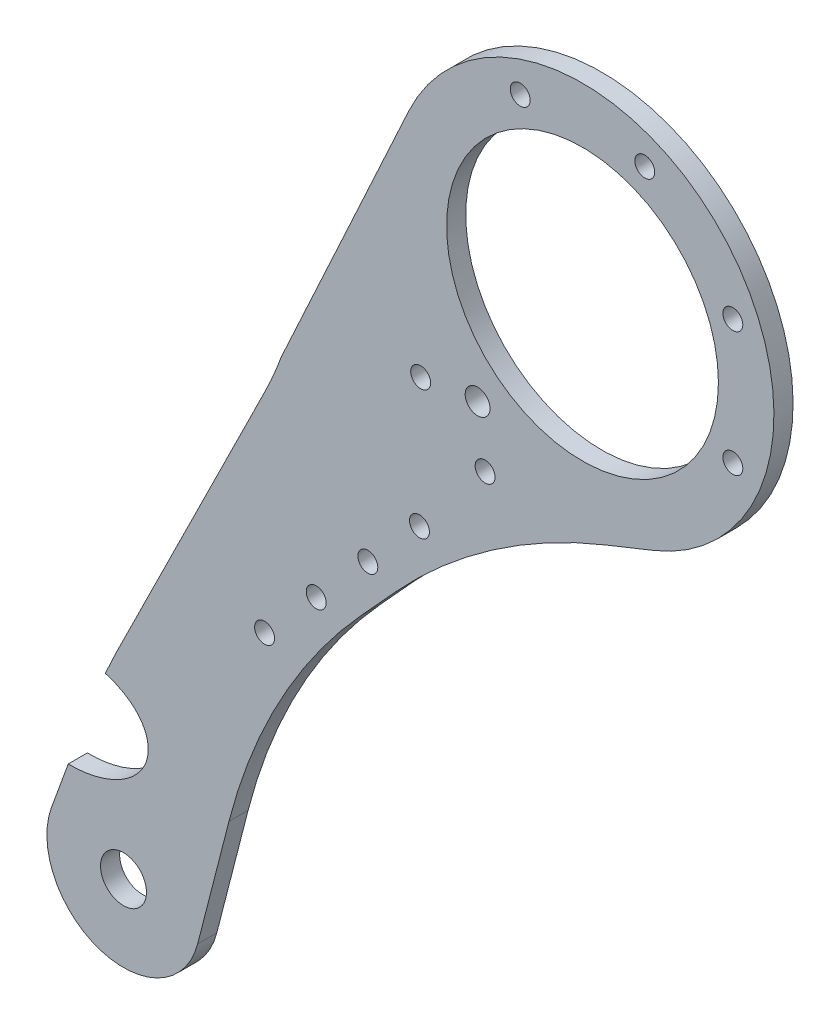
ISO-10303-21;
HEADER;
FILE_DESCRIPTION(('STEP AP214'),'2;1');
FILE_NAME('part.step','',(''),(''),'','','');
FILE_SCHEMA(('AUTOMOTIVE_DESIGN { 1 0 10303 214 1 1 1 1 }'));
ENDSEC;
DATA;
#1=APPLICATION_CONTEXT('core data for automotive mechanical design processes');
#2=APPLICATION_PROTOCOL_DEFINITION('international standard','automotive_design',2000,#1);
#3=PRODUCT_CONTEXT('',#1,'mechanical');
#4=PRODUCT('Part','Part','',(#3));
#5=PRODUCT_RELATED_PRODUCT_CATEGORY('part','',(#4));
#6=PRODUCT_DEFINITION_FORMATION('','',#4);
#7=PRODUCT_DEFINITION_CONTEXT('part definition',#1,'design');
#8=PRODUCT_DEFINITION('design','',#6,#7);
#9=PRODUCT_DEFINITION_SHAPE('','',#8);
#10=(LENGTH_UNIT() NAMED_UNIT(*) SI_UNIT(.MILLI.,.METRE.));
#11=(NAMED_UNIT(*) PLANE_ANGLE_UNIT() SI_UNIT($,.RADIAN.));
#12=(NAMED_UNIT(*) SI_UNIT($,.STERADIAN.) SOLID_ANGLE_UNIT());
#13=UNCERTAINTY_MEASURE_WITH_UNIT(LENGTH_MEASURE(1.E-05),#10,'distance_accuracy_value','');
#14=(GEOMETRIC_REPRESENTATION_CONTEXT(3) GLOBAL_UNCERTAINTY_ASSIGNED_CONTEXT((#13)) GLOBAL_UNIT_ASSIGNED_CONTEXT((#10,
#11,#12)) REPRESENTATION_CONTEXT('',''));
#15=CARTESIAN_POINT('',(0.,0.,0.));
#16=DIRECTION('',(0.,0.,1.));
#17=DIRECTION('',(1.,0.,0.));
#18=AXIS2_PLACEMENT_3D('',#15,#16,#17);
#19=CARTESIAN_POINT('',(-87.2473558230127,-77.9723044074539,-5.));
#20=DIRECTION('',(0.,0.,-1.));
#21=DIRECTION('',(1.,0.,0.));
#22=AXIS2_PLACEMENT_3D('',#19,#20,#21);
#23=PLANE('',#22);
#24=CARTESIAN_POINT('',(18.3767093876581,44.2943786461941,-5.));
#25=DIRECTION('',(0.,0.,1.));
#26=DIRECTION('',(1.,0.,0.));
#27=AXIS2_PLACEMENT_3D('',#24,#25,#26);
#28=CIRCLE('',#27,3.25);
#29=CARTESIAN_POINT('',(21.6267093876581,44.2943786461941,-5.));
#30=VERTEX_POINT('',#29);
#31=EDGE_CURVE('E346',#30,#30,#28,.T.);
#32=ORIENTED_EDGE('',*,*,#31,.T.);
#33=EDGE_LOOP('',(#32));
#34=FACE_BOUND('',#33,.T.);
#35=CARTESIAN_POINT('',(29.5069278175342,119.260159091029,-5.));
#36=DIRECTION('',(0.,0.,1.));
#37=DIRECTION('',(1.,0.,0.));
#38=AXIS2_PLACEMENT_3D('',#35,#36,#37);
#39=CIRCLE('',#38,2.6);
#40=CARTESIAN_POINT('',(32.1069278175342,119.260159091029,-5.));
#41=VERTEX_POINT('',#40);
#42=EDGE_CURVE('E360',#41,#41,#39,.T.);
#43=ORIENTED_EDGE('',*,*,#42,.T.);
#44=EDGE_LOOP('',(#43));
#45=FACE_BOUND('',#44,.T.);
#46=CARTESIAN_POINT('',(62.0350195685669,119.260159091029,-5.));
#47=DIRECTION('',(0.,0.,1.));
#48=DIRECTION('',(1.,0.,0.));
#49=AXIS2_PLACEMENT_3D('',#46,#47,#48);
#50=CIRCLE('',#49,2.6);
#51=CARTESIAN_POINT('',(64.6350195685669,119.260159091029,-5.));
#52=VERTEX_POINT('',#51);
#53=EDGE_CURVE('E368',#52,#52,#50,.T.);
#54=ORIENTED_EDGE('',*,*,#53,.T.);
#55=EDGE_LOOP('',(#54));
#56=FACE_BOUND('',#55,.T.);
#57=CARTESIAN_POINT('',(85.0358538247802,96.259324834816,-5.));
#58=DIRECTION('',(0.,0.,1.));
#59=DIRECTION('',(1.,0.,0.));
#60=AXIS2_PLACEMENT_3D('',#57,#58,#59);
#61=CIRCLE('',#60,2.60000000000002);
#62=CARTESIAN_POINT('',(87.6358538247802,96.259324834816,-5.));
#63=VERTEX_POINT('',#62);
#64=EDGE_CURVE('E376',#63,#63,#61,.T.);
#65=ORIENTED_EDGE('',*,*,#64,.T.);
#66=EDGE_LOOP('',(#65));
#67=FACE_BOUND('',#66,.T.);
#68=CARTESIAN_POINT('',(85.0358538247802,63.7312330837833,-5.));
#69=DIRECTION('',(0.,0.,1.));
#70=DIRECTION('',(1.,0.,0.));
#71=AXIS2_PLACEMENT_3D('',#68,#69,#70);
#72=CIRCLE('',#71,2.6);
#73=CARTESIAN_POINT('',(87.6358538247802,63.7312330837833,-5.));
#74=VERTEX_POINT('',#73);
#75=EDGE_CURVE('E352',#74,#74,#72,.T.);
#76=ORIENTED_EDGE('',*,*,#75,.T.);
#77=EDGE_LOOP('',(#76));
#78=FACE_BOUND('',#77,.T.);
#79=CARTESIAN_POINT('',(-23.7747681862979,-21.0648015144859,-5.));
#80=DIRECTION('',(0.,0.,1.));
#81=DIRECTION('',(1.,0.,0.));
#82=AXIS2_PLACEMENT_3D('',#79,#80,#81);
#83=CIRCLE('',#82,2.6);
#84=CARTESIAN_POINT('',(-21.1747681862979,-21.0648015144859,-5.));
#85=VERTEX_POINT('',#84);
#86=EDGE_CURVE('E395',#85,#85,#83,.T.);
#87=ORIENTED_EDGE('',*,*,#86,.T.);
#88=EDGE_LOOP('',(#87));
#89=FACE_BOUND('',#88,.T.);
#90=CARTESIAN_POINT('',(-37.2593092551394,-35.8352839765698,-5.));
#91=DIRECTION('',(0.,0.,1.));
#92=DIRECTION('',(1.,0.,0.));
#93=AXIS2_PLACEMENT_3D('',#90,#91,#92);
#94=CIRCLE('',#93,2.6);
#95=CARTESIAN_POINT('',(-34.6593092551394,-35.8352839765698,-5.));
#96=VERTEX_POINT('',#95);
#97=EDGE_CURVE('E411',#96,#96,#94,.T.);
#98=ORIENTED_EDGE('',*,*,#97,.T.);
#99=EDGE_LOOP('',(#98));
#100=FACE_BOUND('',#99,.T.);
#101=CARTESIAN_POINT('',(3.50503646705098,42.3364857628933,-5.));
#102=DIRECTION('',(0.,0.,1.));
#103=DIRECTION('',(1.,0.,0.));
#104=AXIS2_PLACEMENT_3D('',#101,#102,#103);
#105=CIRCLE('',#104,2.6);
#106=CARTESIAN_POINT('',(6.10503646705098,42.3364857628933,-5.));
#107=VERTEX_POINT('',#106);
#108=EDGE_CURVE('E419',#107,#107,#105,.T.);
#109=ORIENTED_EDGE('',*,*,#108,.T.);
#110=EDGE_LOOP('',(#109));
#111=FACE_BOUND('',#110,.T.);
#112=CARTESIAN_POINT('',(-74.1078932401975,-109.9952789593,-5.));
#113=DIRECTION('',(0.,0.,1.));
#114=DIRECTION('',(1.,0.,0.));
#115=AXIS2_PLACEMENT_3D('',#112,#113,#114);
#116=CIRCLE('',#115,6.00000000000002);
#117=CARTESIAN_POINT('',(-68.1078932401974,-109.9952789593,-5.));
#118=VERTEX_POINT('',#117);
#119=EDGE_CURVE('E433',#118,#118,#116,.T.);
#120=ORIENTED_EDGE('',*,*,#119,.T.);
#121=EDGE_LOOP('',(#120));
#122=FACE_BOUND('',#121,.T.);
#123=CARTESIAN_POINT('',(20.3346022709589,29.4227057255869,-5.));
#124=DIRECTION('',(0.,0.,1.));
#125=DIRECTION('',(1.,0.,0.));
#126=AXIS2_PLACEMENT_3D('',#123,#124,#125);
#127=CIRCLE('',#126,2.6);
#128=CARTESIAN_POINT('',(22.9346022709589,29.4227057255869,-5.));
#129=VERTEX_POINT('',#128);
#130=EDGE_CURVE('E427',#129,#129,#127,.T.);
#131=ORIENTED_EDGE('',*,*,#130,.T.);
#132=EDGE_LOOP('',(#131));
#133=FACE_BOUND('',#132,.T.);
#134=CARTESIAN_POINT('',(-10.2902271174564,-6.294319052402,-5.));
#135=DIRECTION('',(0.,0.,1.));
#136=DIRECTION('',(1.,0.,0.));
#137=AXIS2_PLACEMENT_3D('',#134,#135,#136);
#138=CIRCLE('',#137,2.6);
#139=CARTESIAN_POINT('',(-7.69022711745644,-6.294319052402,-5.));
#140=VERTEX_POINT('',#139);
#141=EDGE_CURVE('E403',#140,#140,#138,.T.);
#142=ORIENTED_EDGE('',*,*,#141,.T.);
#143=EDGE_LOOP('',(#142));
#144=FACE_BOUND('',#143,.T.);
#145=CARTESIAN_POINT('',(3.19431395138503,8.4761634096819,-5.));
#146=DIRECTION('',(0.,0.,1.));
#147=DIRECTION('',(1.,0.,0.));
#148=AXIS2_PLACEMENT_3D('',#145,#146,#147);
#149=CIRCLE('',#148,2.6);
#150=CARTESIAN_POINT('',(5.79431395138502,8.4761634096819,-5.));
#151=VERTEX_POINT('',#150);
#152=EDGE_CURVE('E387',#151,#151,#149,.T.);
#153=ORIENTED_EDGE('',*,*,#152,.T.);
#154=EDGE_LOOP('',(#153));
#155=FACE_BOUND('',#154,.T.);
#156=CARTESIAN_POINT('',(-74.1078932401975,-109.9952789593,-5.));
#157=DIRECTION('',(0.,0.,1.));
#158=DIRECTION('',(1.,0.,0.));
#159=AXIS2_PLACEMENT_3D('',#156,#157,#158);
#160=CIRCLE('',#159,20.0000000000002);
#161=CARTESIAN_POINT('',(-92.9017456559157,-103.154876092786,-5.));
#162=VERTEX_POINT('',#161);
#163=CARTESIAN_POINT('',(-54.7372550512299,-114.973067238457,-5.));
#164=VERTEX_POINT('',#163);
#165=EDGE_CURVE('E290',#162,#164,#160,.T.);
#166=ORIENTED_EDGE('',*,*,#165,.F.);
#167=DIRECTION('',(-0.342020143325669,-0.939692620785908,0.));
#168=VECTOR('',#167,1.);
#169=CARTESIAN_POINT('',(-88.5355343691892,-91.158809173937,-5.));
#170=LINE('',#169,#168);
#171=CARTESIAN_POINT('',(-88.5355343691892,-91.158809173937,-5.));
#172=VERTEX_POINT('',#171);
#173=EDGE_CURVE('E204',#172,#162,#170,.T.);
#174=ORIENTED_EDGE('',*,*,#173,.F.);
#175=CARTESIAN_POINT('',(-87.2473558230127,-77.9723044074539,-5.));
#176=DIRECTION('',(0.,0.,-1.));
#177=DIRECTION('',(0.998564288915161,0.0535664158158636,0.));
#178=AXIS2_PLACEMENT_3D('',#175,#176,#177);
#179=ELLIPSE('',#178,19.6254544070607,13.1666159932936);
#180=CARTESIAN_POINT('',(-78.8301753664011,-65.8229118304964,-5.));
#181=VERTEX_POINT('',#180);
#182=EDGE_CURVE('E199',#181,#172,#179,.T.);
#183=ORIENTED_EDGE('',*,*,#182,.F.);
#184=CARTESIAN_POINT('',(104.071308496632,-146.736737600266,-5.));
#185=DIRECTION('',(0.,0.,1.));
#186=DIRECTION('',(1.,0.,0.));
#187=AXIS2_PLACEMENT_3D('',#184,#185,#186);
#188=CIRCLE('',#187,200.);
#189=CARTESIAN_POINT('',(-75.1568945937203,-57.9828575892863,-5.));
#190=VERTEX_POINT('',#189);
#191=EDGE_CURVE('E195',#190,#181,#188,.T.);
#192=ORIENTED_EDGE('',*,*,#191,.F.);
#193=DIRECTION('',(-0.443769400054901,-0.896141015451761,0.));
#194=VECTOR('',#193,1.);
#195=CARTESIAN_POINT('',(-37.2097827502313,18.6469491001312,-5.));
#196=LINE('',#195,#194);
#197=CARTESIAN_POINT('',(-37.2097827502313,18.6469491001312,-5.));
#198=VERTEX_POINT('',#197);
#199=EDGE_CURVE('E191',#198,#190,#196,.T.);
#200=ORIENTED_EDGE('',*,*,#199,.F.);
#201=CARTESIAN_POINT('',(-126.823884295407,63.0238891056213,-5.));
#202=DIRECTION('',(0.,0.,-1.));
#203=DIRECTION('',(1.,0.,0.));
#204=AXIS2_PLACEMENT_3D('',#201,#202,#203);
#205=CIRCLE('',#204,100.);
#206=CARTESIAN_POINT('',(-32.8546222168167,28.8218747730539,-5.));
#207=VERTEX_POINT('',#206);
#208=EDGE_CURVE('E179',#207,#198,#205,.T.);
#209=ORIENTED_EDGE('',*,*,#208,.F.);
#210=DIRECTION('',(-0.418420104800895,-0.908253607699088,0.));
#211=VECTOR('',#210,1.);
#212=CARTESIAN_POINT('',(0.358293308096093,100.916284199344,-5.));
#213=LINE('',#212,#211);
#214=CARTESIAN_POINT('',(0.358293308096093,100.916284199344,-5.));
#215=VERTEX_POINT('',#214);
#216=EDGE_CURVE('E173',#215,#207,#213,.T.);
#217=ORIENTED_EDGE('',*,*,#216,.F.);
#218=CARTESIAN_POINT('',(45.7709736930505,79.9952789592997,-5.));
#219=DIRECTION('',(0.,0.,1.));
#220=DIRECTION('',(1.,0.,0.));
#221=AXIS2_PLACEMENT_3D('',#218,#219,#220);
#222=CIRCLE('',#221,50.);
#223=CARTESIAN_POINT('',(64.3764573363395,33.5858404968565,-5.));
#224=VERTEX_POINT('',#223);
#225=EDGE_CURVE('E147',#224,#215,#222,.T.);
#226=ORIENTED_EDGE('',*,*,#225,.F.);
#227=DIRECTION('',(-0.928188769248865,-0.37210967286578,0.));
#228=VECTOR('',#227,1.);
#229=CARTESIAN_POINT('',(-2.68622157797908,6.70049956291646,-5.));
#230=LINE('',#229,#228);
#231=CARTESIAN_POINT('',(51.8864623927853,28.5786177351522,-5.));
#232=VERTEX_POINT('',#231);
#233=EDGE_CURVE('E159',#224,#232,#230,.T.);
#234=ORIENTED_EDGE('',*,*,#233,.T.);
#235=CARTESIAN_POINT('',(107.702913322652,-110.649697652178,-5.));
#236=DIRECTION('',(0.,0.,1.));
#237=DIRECTION('',(1.,0.,0.));
#238=AXIS2_PLACEMENT_3D('',#235,#236,#237);
#239=CIRCLE('',#238,150.);
#240=CARTESIAN_POINT('',(-3.07570514297694,-9.51563963586652,-5.));
#241=VERTEX_POINT('',#240);
#242=EDGE_CURVE('E327',#241,#232,#239,.F.);
#243=ORIENTED_EDGE('',*,*,#242,.F.);
#244=DIRECTION('',(0.674227053442074,0.738524123104194,0.));
#245=VECTOR('',#244,1.);
#246=CARTESIAN_POINT('',(3.06060587253825,-2.79414472003352,-5.));
#247=LINE('',#246,#245);
#248=CARTESIAN_POINT('',(-12.060299563704,-19.3570419974885,-5.));
#249=VERTEX_POINT('',#248);
#250=EDGE_CURVE('E166',#249,#241,#247,.T.);
#251=ORIENTED_EDGE('',*,*,#250,.F.);
#252=CARTESIAN_POINT('',(98.7183189019252,-120.4911000138,-5.));
#253=DIRECTION('',(0.,0.,1.));
#254=DIRECTION('',(1.,0.,0.));
#255=AXIS2_PLACEMENT_3D('',#252,#253,#254);
#256=CIRCLE('',#255,150.);
#257=CARTESIAN_POINT('',(-46.5614675153302,-83.1576879201177,-5.));
#258=VERTEX_POINT('',#257);
#259=EDGE_CURVE('E58',#258,#249,#256,.F.);
#260=ORIENTED_EDGE('',*,*,#259,.F.);
#261=DIRECTION('',(-0.248889413957879,-0.968531909448369,0.));
#262=VECTOR('',#261,1.);
#263=CARTESIAN_POINT('',(-23.6314026287413,6.07270229704667,-5.));
#264=LINE('',#263,#262);
#265=EDGE_CURVE('E156',#258,#164,#264,.T.);
#266=ORIENTED_EDGE('',*,*,#265,.T.);
#267=EDGE_LOOP('',(#166,#174,#183,#192,#200,#209,#217,#226,#234,#243,#251,#260,#266));
#268=FACE_BOUND('',#267,.T.);
#269=CARTESIAN_POINT('',(45.7709736930505,79.9952789592997,-5.));
#270=DIRECTION('',(0.,0.,1.));
#271=DIRECTION('',(1.,0.,0.));
#272=AXIS2_PLACEMENT_3D('',#269,#270,#271);
#273=CIRCLE('',#272,35.5);
#274=CARTESIAN_POINT('',(81.2709736930505,79.9952789592997,-5.));
#275=VERTEX_POINT('',#274);
#276=EDGE_CURVE('E707',#275,#275,#273,.T.);
#277=ORIENTED_EDGE('',*,*,#276,.T.);
#278=EDGE_LOOP('',(#277));
#279=FACE_BOUND('',#278,.T.);
#280=ADVANCED_FACE('F49',(#34,#45,#56,#67,#78,#89,#100,#111,#122,#133,#144,#155,#268,#279),#23,.T.);
#281=CARTESIAN_POINT('',(-87.2473558230127,-77.9723044074539,0.));
#282=DIRECTION('',(0.,0.,-1.));
#283=DIRECTION('',(1.,0.,0.));
#284=AXIS2_PLACEMENT_3D('',#281,#282,#283);
#285=PLANE('',#284);
#286=CARTESIAN_POINT('',(3.19431395138503,8.4761634096819,0.));
#287=DIRECTION('',(0.,0.,1.));
#288=DIRECTION('',(1.,0.,0.));
#289=AXIS2_PLACEMENT_3D('',#286,#287,#288);
#290=CIRCLE('',#289,2.6);
#291=CARTESIAN_POINT('',(5.79431395138502,8.4761634096819,0.));
#292=VERTEX_POINT('',#291);
#293=EDGE_CURVE('E359',#292,#292,#290,.T.);
#294=ORIENTED_EDGE('',*,*,#293,.F.);
#295=EDGE_LOOP('',(#294));
#296=FACE_BOUND('',#295,.T.);
#297=CARTESIAN_POINT('',(-23.7747681862979,-21.0648015144859,0.));
#298=DIRECTION('',(0.,0.,1.));
#299=DIRECTION('',(1.,0.,0.));
#300=AXIS2_PLACEMENT_3D('',#297,#298,#299);
#301=CIRCLE('',#300,2.6);
#302=CARTESIAN_POINT('',(-21.1747681862979,-21.0648015144859,0.));
#303=VERTEX_POINT('',#302);
#304=EDGE_CURVE('E391',#303,#303,#301,.T.);
#305=ORIENTED_EDGE('',*,*,#304,.F.);
#306=EDGE_LOOP('',(#305));
#307=FACE_BOUND('',#306,.T.);
#308=CARTESIAN_POINT('',(-10.2902271174564,-6.294319052402,0.));
#309=DIRECTION('',(0.,0.,1.));
#310=DIRECTION('',(1.,0.,0.));
#311=AXIS2_PLACEMENT_3D('',#308,#309,#310);
#312=CIRCLE('',#311,2.6);
#313=CARTESIAN_POINT('',(-7.69022711745644,-6.294319052402,0.));
#314=VERTEX_POINT('',#313);
#315=EDGE_CURVE('E399',#314,#314,#312,.T.);
#316=ORIENTED_EDGE('',*,*,#315,.F.);
#317=EDGE_LOOP('',(#316));
#318=FACE_BOUND('',#317,.T.);
#319=CARTESIAN_POINT('',(-37.2593092551394,-35.8352839765698,0.));
#320=DIRECTION('',(0.,0.,1.));
#321=DIRECTION('',(1.,0.,0.));
#322=AXIS2_PLACEMENT_3D('',#319,#320,#321);
#323=CIRCLE('',#322,2.6);
#324=CARTESIAN_POINT('',(-34.6593092551394,-35.8352839765698,0.));
#325=VERTEX_POINT('',#324);
#326=EDGE_CURVE('E407',#325,#325,#323,.T.);
#327=ORIENTED_EDGE('',*,*,#326,.F.);
#328=EDGE_LOOP('',(#327));
#329=FACE_BOUND('',#328,.T.);
#330=CARTESIAN_POINT('',(3.50503646705098,42.3364857628933,0.));
#331=DIRECTION('',(0.,0.,1.));
#332=DIRECTION('',(1.,0.,0.));
#333=AXIS2_PLACEMENT_3D('',#330,#331,#332);
#334=CIRCLE('',#333,2.6);
#335=CARTESIAN_POINT('',(6.10503646705098,42.3364857628933,0.));
#336=VERTEX_POINT('',#335);
#337=EDGE_CURVE('E415',#336,#336,#334,.T.);
#338=ORIENTED_EDGE('',*,*,#337,.F.);
#339=EDGE_LOOP('',(#338));
#340=FACE_BOUND('',#339,.T.);
#341=CARTESIAN_POINT('',(20.3346022709589,29.4227057255869,0.));
#342=DIRECTION('',(0.,0.,1.));
#343=DIRECTION('',(1.,0.,0.));
#344=AXIS2_PLACEMENT_3D('',#341,#342,#343);
#345=CIRCLE('',#344,2.6);
#346=CARTESIAN_POINT('',(22.9346022709589,29.4227057255869,0.));
#347=VERTEX_POINT('',#346);
#348=EDGE_CURVE('E423',#347,#347,#345,.T.);
#349=ORIENTED_EDGE('',*,*,#348,.F.);
#350=EDGE_LOOP('',(#349));
#351=FACE_BOUND('',#350,.T.);
#352=CARTESIAN_POINT('',(-74.1078932401975,-109.9952789593,0.));
#353=DIRECTION('',(0.,0.,1.));
#354=DIRECTION('',(1.,0.,0.));
#355=AXIS2_PLACEMENT_3D('',#352,#353,#354);
#356=CIRCLE('',#355,6.00000000000002);
#357=CARTESIAN_POINT('',(-68.1078932401974,-109.9952789593,0.));
#358=VERTEX_POINT('',#357);
#359=EDGE_CURVE('E185',#358,#358,#356,.T.);
#360=ORIENTED_EDGE('',*,*,#359,.F.);
#361=EDGE_LOOP('',(#360));
#362=FACE_BOUND('',#361,.T.);
#363=CARTESIAN_POINT('',(85.0358538247802,63.7312330837833,0.));
#364=DIRECTION('',(0.,0.,1.));
#365=DIRECTION('',(1.,0.,0.));
#366=AXIS2_PLACEMENT_3D('',#363,#364,#365);
#367=CIRCLE('',#366,2.6);
#368=CARTESIAN_POINT('',(87.6358538247802,63.7312330837833,0.));
#369=VERTEX_POINT('',#368);
#370=EDGE_CURVE('E380',#369,#369,#367,.T.);
#371=ORIENTED_EDGE('',*,*,#370,.F.);
#372=EDGE_LOOP('',(#371));
#373=FACE_BOUND('',#372,.T.);
#374=CARTESIAN_POINT('',(85.0358538247802,96.259324834816,0.));
#375=DIRECTION('',(0.,0.,1.));
#376=DIRECTION('',(1.,0.,0.));
#377=AXIS2_PLACEMENT_3D('',#374,#375,#376);
#378=CIRCLE('',#377,2.60000000000002);
#379=CARTESIAN_POINT('',(87.6358538247802,96.259324834816,0.));
#380=VERTEX_POINT('',#379);
#381=EDGE_CURVE('E372',#380,#380,#378,.T.);
#382=ORIENTED_EDGE('',*,*,#381,.F.);
#383=EDGE_LOOP('',(#382));
#384=FACE_BOUND('',#383,.T.);
#385=CARTESIAN_POINT('',(62.0350195685669,119.260159091029,0.));
#386=DIRECTION('',(0.,0.,1.));
#387=DIRECTION('',(1.,0.,0.));
#388=AXIS2_PLACEMENT_3D('',#385,#386,#387);
#389=CIRCLE('',#388,2.6);
#390=CARTESIAN_POINT('',(64.6350195685669,119.260159091029,0.));
#391=VERTEX_POINT('',#390);
#392=EDGE_CURVE('E364',#391,#391,#389,.T.);
#393=ORIENTED_EDGE('',*,*,#392,.F.);
#394=EDGE_LOOP('',(#393));
#395=FACE_BOUND('',#394,.T.);
#396=CARTESIAN_POINT('',(29.5069278175342,119.260159091029,0.));
#397=DIRECTION('',(0.,0.,1.));
#398=DIRECTION('',(1.,0.,0.));
#399=AXIS2_PLACEMENT_3D('',#396,#397,#398);
#400=CIRCLE('',#399,2.6);
#401=CARTESIAN_POINT('',(32.1069278175342,119.260159091029,0.));
#402=VERTEX_POINT('',#401);
#403=EDGE_CURVE('E355',#402,#402,#400,.T.);
#404=ORIENTED_EDGE('',*,*,#403,.F.);
#405=EDGE_LOOP('',(#404));
#406=FACE_BOUND('',#405,.T.);
#407=CARTESIAN_POINT('',(18.3767093876581,44.2943786461941,0.));
#408=DIRECTION('',(0.,0.,1.));
#409=DIRECTION('',(1.,0.,0.));
#410=AXIS2_PLACEMENT_3D('',#407,#408,#409);
#411=CIRCLE('',#410,3.25);
#412=CARTESIAN_POINT('',(21.6267093876581,44.2943786461941,0.));
#413=VERTEX_POINT('',#412);
#414=EDGE_CURVE('E348',#413,#413,#411,.T.);
#415=ORIENTED_EDGE('',*,*,#414,.F.);
#416=EDGE_LOOP('',(#415));
#417=FACE_BOUND('',#416,.T.);
#418=DIRECTION('',(0.674227053442074,0.738524123104194,0.));
#419=VECTOR('',#418,1.);
#420=CARTESIAN_POINT('',(-75.4254611049529,-88.7649664106359,0.));
#421=LINE('',#420,#419);
#422=CARTESIAN_POINT('',(-12.060299563704,-19.3570419974885,0.));
#423=VERTEX_POINT('',#422);
#424=CARTESIAN_POINT('',(-3.07570514297693,-9.51563963586652,0.));
#425=VERTEX_POINT('',#424);
#426=EDGE_CURVE('E311',#423,#425,#421,.T.);
#427=ORIENTED_EDGE('',*,*,#426,.T.);
#428=CARTESIAN_POINT('',(107.702913322652,-110.649697652178,0.));
#429=DIRECTION('',(0.,0.,1.));
#430=DIRECTION('',(1.,0.,0.));
#431=AXIS2_PLACEMENT_3D('',#428,#429,#430);
#432=CIRCLE('',#431,150.);
#433=CARTESIAN_POINT('',(51.8864623927853,28.5786177351522,0.));
#434=VERTEX_POINT('',#433);
#435=EDGE_CURVE('E330',#434,#425,#432,.T.);
#436=ORIENTED_EDGE('',*,*,#435,.F.);
#437=DIRECTION('',(-0.928188769248865,-0.37210967286578,0.));
#438=VECTOR('',#437,1.);
#439=CARTESIAN_POINT('',(-104.783518952916,-34.2301744393261,0.));
#440=LINE('',#439,#438);
#441=CARTESIAN_POINT('',(64.3764573363395,33.5858404968565,0.));
#442=VERTEX_POINT('',#441);
#443=EDGE_CURVE('E308',#442,#434,#440,.T.);
#444=ORIENTED_EDGE('',*,*,#443,.F.);
#445=CARTESIAN_POINT('',(45.7709736930505,79.9952789592997,0.));
#446=DIRECTION('',(0.,0.,1.));
#447=DIRECTION('',(1.,0.,0.));
#448=AXIS2_PLACEMENT_3D('',#445,#446,#447);
#449=CIRCLE('',#448,50.);
#450=CARTESIAN_POINT('',(0.358293308096093,100.916284199344,0.));
#451=VERTEX_POINT('',#450);
#452=EDGE_CURVE('E150',#442,#451,#449,.T.);
#453=ORIENTED_EDGE('',*,*,#452,.T.);
#454=DIRECTION('',(-0.418420104800895,-0.908253607699088,0.));
#455=VECTOR('',#454,1.);
#456=CARTESIAN_POINT('',(0.358293308096093,100.916284199344,0.));
#457=LINE('',#456,#455);
#458=CARTESIAN_POINT('',(-32.8546222168167,28.8218747730539,0.));
#459=VERTEX_POINT('',#458);
#460=EDGE_CURVE('E440',#451,#459,#457,.T.);
#461=ORIENTED_EDGE('',*,*,#460,.T.);
#462=CARTESIAN_POINT('',(-126.823884295407,63.0238891056213,0.));
#463=DIRECTION('',(0.,0.,-1.));
#464=DIRECTION('',(1.,0.,0.));
#465=AXIS2_PLACEMENT_3D('',#462,#463,#464);
#466=CIRCLE('',#465,100.);
#467=CARTESIAN_POINT('',(-37.2097827502313,18.6469491001312,0.));
#468=VERTEX_POINT('',#467);
#469=EDGE_CURVE('E720',#459,#468,#466,.T.);
#470=ORIENTED_EDGE('',*,*,#469,.T.);
#471=DIRECTION('',(-0.443769400054901,-0.896141015451761,0.));
#472=VECTOR('',#471,1.);
#473=CARTESIAN_POINT('',(-37.2097827502313,18.6469491001312,0.));
#474=LINE('',#473,#472);
#475=CARTESIAN_POINT('',(-75.1568945937203,-57.9828575892863,0.));
#476=VERTEX_POINT('',#475);
#477=EDGE_CURVE('E724',#468,#476,#474,.T.);
#478=ORIENTED_EDGE('',*,*,#477,.T.);
#479=CARTESIAN_POINT('',(104.071308496632,-146.736737600266,0.));
#480=DIRECTION('',(0.,0.,1.));
#481=DIRECTION('',(1.,0.,0.));
#482=AXIS2_PLACEMENT_3D('',#479,#480,#481);
#483=CIRCLE('',#482,200.);
#484=CARTESIAN_POINT('',(-78.8301753664011,-65.8229118304964,0.));
#485=VERTEX_POINT('',#484);
#486=EDGE_CURVE('E283',#476,#485,#483,.T.);
#487=ORIENTED_EDGE('',*,*,#486,.T.);
#488=CARTESIAN_POINT('',(-87.2473558230127,-77.9723044074539,0.));
#489=DIRECTION('',(0.,0.,-1.));
#490=DIRECTION('',(0.998564288915161,0.0535664158158636,0.));
#491=AXIS2_PLACEMENT_3D('',#488,#489,#490);
#492=ELLIPSE('',#491,19.6254544070607,13.1666159932936);
#493=CARTESIAN_POINT('',(-88.5355343691892,-91.158809173937,0.));
#494=VERTEX_POINT('',#493);
#495=EDGE_CURVE('E279',#485,#494,#492,.T.);
#496=ORIENTED_EDGE('',*,*,#495,.T.);
#497=DIRECTION('',(-0.342020143325669,-0.939692620785908,0.));
#498=VECTOR('',#497,1.);
#499=CARTESIAN_POINT('',(-88.5355343691892,-91.158809173937,0.));
#500=LINE('',#499,#498);
#501=CARTESIAN_POINT('',(-92.9017456559157,-103.154876092786,0.));
#502=VERTEX_POINT('',#501);
#503=EDGE_CURVE('E182',#494,#502,#500,.T.);
#504=ORIENTED_EDGE('',*,*,#503,.T.);
#505=CARTESIAN_POINT('',(-74.1078932401975,-109.9952789593,0.));
#506=DIRECTION('',(0.,0.,1.));
#507=DIRECTION('',(1.,0.,0.));
#508=AXIS2_PLACEMENT_3D('',#505,#506,#507);
#509=CIRCLE('',#508,20.0000000000002);
#510=CARTESIAN_POINT('',(-54.7372550512299,-114.973067238457,0.));
#511=VERTEX_POINT('',#510);
#512=EDGE_CURVE('E175',#502,#511,#509,.T.);
#513=ORIENTED_EDGE('',*,*,#512,.T.);
#514=DIRECTION('',(-0.24888941395788,-0.968531909448369,0.));
#515=VECTOR('',#514,1.);
#516=CARTESIAN_POINT('',(-47.8318183737261,-88.1011498495986,0.));
#517=LINE('',#516,#515);
#518=CARTESIAN_POINT('',(-46.5614675153302,-83.1576879201176,0.));
#519=VERTEX_POINT('',#518);
#520=EDGE_CURVE('E314',#519,#511,#517,.T.);
#521=ORIENTED_EDGE('',*,*,#520,.F.);
#522=CARTESIAN_POINT('',(98.7183189019252,-120.4911000138,0.));
#523=DIRECTION('',(0.,0.,1.));
#524=DIRECTION('',(1.,0.,0.));
#525=AXIS2_PLACEMENT_3D('',#522,#523,#524);
#526=CIRCLE('',#525,150.);
#527=EDGE_CURVE('E11',#423,#519,#526,.T.);
#528=ORIENTED_EDGE('',*,*,#527,.F.);
#529=EDGE_LOOP('',(#427,#436,#444,#453,#461,#470,#478,#487,#496,#504,#513,#521,#528));
#530=FACE_BOUND('',#529,.T.);
#531=CARTESIAN_POINT('',(45.7709736930505,79.9952789592997,0.));
#532=DIRECTION('',(0.,0.,1.));
#533=DIRECTION('',(1.,0.,0.));
#534=AXIS2_PLACEMENT_3D('',#531,#532,#533);
#535=CIRCLE('',#534,35.5);
#536=CARTESIAN_POINT('',(81.2709736930505,79.9952789592997,0.));
#537=VERTEX_POINT('',#536);
#538=EDGE_CURVE('E167',#537,#537,#535,.T.);
#539=ORIENTED_EDGE('',*,*,#538,.F.);
#540=EDGE_LOOP('',(#539));
#541=FACE_BOUND('',#540,.T.);
#542=ADVANCED_FACE('F231',(#296,#307,#318,#329,#340,#351,#362,#373,#384,#395,#406,#417,#530,
#541),#285,.F.);
#543=CARTESIAN_POINT('',(45.7709736930505,79.9952789592997,-5.));
#544=DIRECTION('',(0.,0.,1.));
#545=DIRECTION('',(-1.,0.,0.));
#546=AXIS2_PLACEMENT_3D('',#543,#544,#545);
#547=CYLINDRICAL_SURFACE('',#546,50.);
#548=ORIENTED_EDGE('',*,*,#452,.F.);
#549=DIRECTION('',(0.,0.,-1.));
#550=VECTOR('',#549,1.);
#551=CARTESIAN_POINT('',(64.3764573363395,33.5858404968565,5.));
#552=LINE('',#551,#550);
#553=EDGE_CURVE('E143',#442,#224,#552,.T.);
#554=ORIENTED_EDGE('',*,*,#553,.T.);
#555=ORIENTED_EDGE('',*,*,#225,.T.);
#556=DIRECTION('',(0.,0.,1.));
#557=VECTOR('',#556,1.);
#558=CARTESIAN_POINT('',(0.358293308096093,100.916284199344,-5.));
#559=LINE('',#558,#557);
#560=EDGE_CURVE('E305',#215,#451,#559,.T.);
#561=ORIENTED_EDGE('',*,*,#560,.T.);
#562=EDGE_LOOP('',(#548,#554,#555,#561));
#563=FACE_BOUND('',#562,.T.);
#564=ADVANCED_FACE('F145',(#563),#547,.T.);
#565=CARTESIAN_POINT('',(0.358293308096093,100.916284199344,-5.));
#566=DIRECTION('',(0.908253607699088,-0.418420104800895,0.));
#567=DIRECTION('',(0.418420104800895,0.908253607699088,0.));
#568=AXIS2_PLACEMENT_3D('',#565,#566,#567);
#569=PLANE('',#568);
#570=ORIENTED_EDGE('',*,*,#460,.F.);
#571=ORIENTED_EDGE('',*,*,#560,.F.);
#572=ORIENTED_EDGE('',*,*,#216,.T.);
#573=DIRECTION('',(0.,0.,1.));
#574=VECTOR('',#573,1.);
#575=CARTESIAN_POINT('',(-32.8546222168167,28.8218747730539,-5.));
#576=LINE('',#575,#574);
#577=EDGE_CURVE('E302',#207,#459,#576,.T.);
#578=ORIENTED_EDGE('',*,*,#577,.T.);
#579=EDGE_LOOP('',(#570,#571,#572,#578));
#580=FACE_BOUND('',#579,.T.);
#581=ADVANCED_FACE('F225',(#580),#569,.F.);
#582=CARTESIAN_POINT('',(-126.823884295407,63.0238891056213,-5.));
#583=DIRECTION('',(0.,0.,1.));
#584=DIRECTION('',(-1.,0.,0.));
#585=AXIS2_PLACEMENT_3D('',#582,#583,#584);
#586=CYLINDRICAL_SURFACE('',#585,100.);
#587=ORIENTED_EDGE('',*,*,#469,.F.);
#588=ORIENTED_EDGE('',*,*,#577,.F.);
#589=ORIENTED_EDGE('',*,*,#208,.T.);
#590=DIRECTION('',(0.,0.,1.));
#591=VECTOR('',#590,1.);
#592=CARTESIAN_POINT('',(-37.2097827502313,18.6469491001312,-5.));
#593=LINE('',#592,#591);
#594=EDGE_CURVE('E299',#198,#468,#593,.T.);
#595=ORIENTED_EDGE('',*,*,#594,.T.);
#596=EDGE_LOOP('',(#587,#588,#589,#595));
#597=FACE_BOUND('',#596,.T.);
#598=ADVANCED_FACE('F221',(#597),#586,.F.);
#599=CARTESIAN_POINT('',(-37.2097827502313,18.6469491001312,-5.));
#600=DIRECTION('',(0.896141015451761,-0.443769400054901,0.));
#601=DIRECTION('',(0.443769400054901,0.896141015451761,0.));
#602=AXIS2_PLACEMENT_3D('',#599,#600,#601);
#603=PLANE('',#602);
#604=ORIENTED_EDGE('',*,*,#477,.F.);
#605=ORIENTED_EDGE('',*,*,#594,.F.);
#606=ORIENTED_EDGE('',*,*,#199,.T.);
#607=DIRECTION('',(0.,0.,1.));
#608=VECTOR('',#607,1.);
#609=CARTESIAN_POINT('',(-75.1568945937203,-57.9828575892863,-5.));
#610=LINE('',#609,#608);
#611=EDGE_CURVE('E296',#190,#476,#610,.T.);
#612=ORIENTED_EDGE('',*,*,#611,.T.);
#613=EDGE_LOOP('',(#604,#605,#606,#612));
#614=FACE_BOUND('',#613,.T.);
#615=ADVANCED_FACE('F217',(#614),#603,.F.);
#616=CARTESIAN_POINT('',(104.071308496632,-146.736737600266,-5.));
#617=DIRECTION('',(0.,0.,1.));
#618=DIRECTION('',(-1.,0.,0.));
#619=AXIS2_PLACEMENT_3D('',#616,#617,#618);
#620=CYLINDRICAL_SURFACE('',#619,200.);
#621=ORIENTED_EDGE('',*,*,#486,.F.);
#622=ORIENTED_EDGE('',*,*,#611,.F.);
#623=ORIENTED_EDGE('',*,*,#191,.T.);
#624=DIRECTION('',(0.,0.,1.));
#625=VECTOR('',#624,1.);
#626=CARTESIAN_POINT('',(-78.8301753664011,-65.8229118304964,-5.));
#627=LINE('',#626,#625);
#628=EDGE_CURVE('E293',#181,#485,#627,.T.);
#629=ORIENTED_EDGE('',*,*,#628,.T.);
#630=EDGE_LOOP('',(#621,#622,#623,#629));
#631=FACE_BOUND('',#630,.T.);
#632=ADVANCED_FACE('F212',(#631),#620,.T.);
#633=DIRECTION('',(0.,0.,1.));
#634=VECTOR('',#633,1.);
#635=SURFACE_OF_LINEAR_EXTRUSION('',#179,#634);
#636=ORIENTED_EDGE('',*,*,#495,.F.);
#637=ORIENTED_EDGE('',*,*,#628,.F.);
#638=ORIENTED_EDGE('',*,*,#182,.T.);
#639=DIRECTION('',(0.,0.,1.));
#640=VECTOR('',#639,1.);
#641=CARTESIAN_POINT('',(-88.5355343691892,-91.158809173937,-5.));
#642=LINE('',#641,#640);
#643=EDGE_CURVE('E289',#172,#494,#642,.T.);
#644=ORIENTED_EDGE('',*,*,#643,.T.);
#645=EDGE_LOOP('',(#636,#637,#638,#644));
#646=FACE_BOUND('',#645,.T.);
#647=ADVANCED_FACE('F207',(#646),#635,.T.);
#648=CARTESIAN_POINT('',(-88.5355343691892,-91.158809173937,-5.));
#649=DIRECTION('',(0.939692620785908,-0.342020143325669,0.));
#650=DIRECTION('',(0.342020143325669,0.939692620785909,0.));
#651=AXIS2_PLACEMENT_3D('',#648,#649,#650);
#652=PLANE('',#651);
#653=ORIENTED_EDGE('',*,*,#503,.F.);
#654=ORIENTED_EDGE('',*,*,#643,.F.);
#655=ORIENTED_EDGE('',*,*,#173,.T.);
#656=DIRECTION('',(0.,0.,1.));
#657=VECTOR('',#656,1.);
#658=CARTESIAN_POINT('',(-92.9017456559157,-103.154876092786,-5.));
#659=LINE('',#658,#657);
#660=EDGE_CURVE('E269',#162,#502,#659,.T.);
#661=ORIENTED_EDGE('',*,*,#660,.T.);
#662=EDGE_LOOP('',(#653,#654,#655,#661));
#663=FACE_BOUND('',#662,.T.);
#664=ADVANCED_FACE('F211',(#663),#652,.F.);
#665=CARTESIAN_POINT('',(-74.1078932401975,-109.9952789593,-5.));
#666=DIRECTION('',(0.,0.,1.));
#667=DIRECTION('',(-1.,0.,0.));
#668=AXIS2_PLACEMENT_3D('',#665,#666,#667);
#669=CYLINDRICAL_SURFACE('',#668,20.0000000000002);
#670=ORIENTED_EDGE('',*,*,#512,.F.);
#671=ORIENTED_EDGE('',*,*,#660,.F.);
#672=ORIENTED_EDGE('',*,*,#165,.T.);
#673=DIRECTION('',(0.,0.,-1.));
#674=VECTOR('',#673,1.);
#675=CARTESIAN_POINT('',(-54.7372550512299,-114.973067238457,5.));
#676=LINE('',#675,#674);
#677=EDGE_CURVE('E155',#511,#164,#676,.T.);
#678=ORIENTED_EDGE('',*,*,#677,.F.);
#679=EDGE_LOOP('',(#670,#671,#672,#678));
#680=FACE_BOUND('',#679,.T.);
#681=ADVANCED_FACE('F256',(#680),#669,.T.);
#682=CARTESIAN_POINT('',(-74.1078932401975,-109.9952789593,-5.));
#683=DIRECTION('',(0.,0.,1.));
#684=DIRECTION('',(-1.,0.,0.));
#685=AXIS2_PLACEMENT_3D('',#682,#683,#684);
#686=CYLINDRICAL_SURFACE('',#685,6.00000000000002);
#687=ORIENTED_EDGE('',*,*,#119,.F.);
#688=EDGE_LOOP('',(#687));
#689=FACE_BOUND('',#688,.T.);
#690=ORIENTED_EDGE('',*,*,#359,.T.);
#691=EDGE_LOOP('',(#690));
#692=FACE_BOUND('',#691,.T.);
#693=ADVANCED_FACE('F254',(#689,#692),#686,.F.);
#694=CARTESIAN_POINT('',(20.3346022709589,29.4227057255869,-5.));
#695=DIRECTION('',(0.,0.,1.));
#696=DIRECTION('',(-1.,0.,0.));
#697=AXIS2_PLACEMENT_3D('',#694,#695,#696);
#698=CYLINDRICAL_SURFACE('',#697,2.6);
#699=ORIENTED_EDGE('',*,*,#130,.F.);
#700=EDGE_LOOP('',(#699));
#701=FACE_BOUND('',#700,.T.);
#702=ORIENTED_EDGE('',*,*,#348,.T.);
#703=EDGE_LOOP('',(#702));
#704=FACE_BOUND('',#703,.T.);
#705=ADVANCED_FACE('F263',(#701,#704),#698,.F.);
#706=CARTESIAN_POINT('',(3.50503646705098,42.3364857628933,-5.));
#707=DIRECTION('',(0.,0.,1.));
#708=DIRECTION('',(-1.,0.,0.));
#709=AXIS2_PLACEMENT_3D('',#706,#707,#708);
#710=CYLINDRICAL_SURFACE('',#709,2.6);
#711=ORIENTED_EDGE('',*,*,#108,.F.);
#712=EDGE_LOOP('',(#711));
#713=FACE_BOUND('',#712,.T.);
#714=ORIENTED_EDGE('',*,*,#337,.T.);
#715=EDGE_LOOP('',(#714));
#716=FACE_BOUND('',#715,.T.);
#717=ADVANCED_FACE('F500',(#713,#716),#710,.F.);
#718=CARTESIAN_POINT('',(-37.2593092551394,-35.8352839765698,-5.));
#719=DIRECTION('',(0.,0.,1.));
#720=DIRECTION('',(-1.,0.,0.));
#721=AXIS2_PLACEMENT_3D('',#718,#719,#720);
#722=CYLINDRICAL_SURFACE('',#721,2.6);
#723=ORIENTED_EDGE('',*,*,#97,.F.);
#724=EDGE_LOOP('',(#723));
#725=FACE_BOUND('',#724,.T.);
#726=ORIENTED_EDGE('',*,*,#326,.T.);
#727=EDGE_LOOP('',(#726));
#728=FACE_BOUND('',#727,.T.);
#729=ADVANCED_FACE('F496',(#725,#728),#722,.F.);
#730=CARTESIAN_POINT('',(-10.2902271174564,-6.294319052402,-5.));
#731=DIRECTION('',(0.,0.,1.));
#732=DIRECTION('',(-1.,0.,0.));
#733=AXIS2_PLACEMENT_3D('',#730,#731,#732);
#734=CYLINDRICAL_SURFACE('',#733,2.6);
#735=ORIENTED_EDGE('',*,*,#141,.F.);
#736=EDGE_LOOP('',(#735));
#737=FACE_BOUND('',#736,.T.);
#738=ORIENTED_EDGE('',*,*,#315,.T.);
#739=EDGE_LOOP('',(#738));
#740=FACE_BOUND('',#739,.T.);
#741=ADVANCED_FACE('F492',(#737,#740),#734,.F.);
#742=CARTESIAN_POINT('',(-23.7747681862979,-21.0648015144859,-5.));
#743=DIRECTION('',(0.,0.,1.));
#744=DIRECTION('',(-1.,0.,0.));
#745=AXIS2_PLACEMENT_3D('',#742,#743,#744);
#746=CYLINDRICAL_SURFACE('',#745,2.6);
#747=ORIENTED_EDGE('',*,*,#86,.F.);
#748=EDGE_LOOP('',(#747));
#749=FACE_BOUND('',#748,.T.);
#750=ORIENTED_EDGE('',*,*,#304,.T.);
#751=EDGE_LOOP('',(#750));
#752=FACE_BOUND('',#751,.T.);
#753=ADVANCED_FACE('F488',(#749,#752),#746,.F.);
#754=CARTESIAN_POINT('',(3.19431395138503,8.4761634096819,-5.));
#755=DIRECTION('',(0.,0.,1.));
#756=DIRECTION('',(-1.,0.,0.));
#757=AXIS2_PLACEMENT_3D('',#754,#755,#756);
#758=CYLINDRICAL_SURFACE('',#757,2.6);
#759=ORIENTED_EDGE('',*,*,#152,.F.);
#760=EDGE_LOOP('',(#759));
#761=FACE_BOUND('',#760,.T.);
#762=ORIENTED_EDGE('',*,*,#293,.T.);
#763=EDGE_LOOP('',(#762));
#764=FACE_BOUND('',#763,.T.);
#765=ADVANCED_FACE('F484',(#761,#764),#758,.F.);
#766=CARTESIAN_POINT('',(85.0358538247802,63.7312330837833,0.));
#767=DIRECTION('',(0.,0.,-1.));
#768=DIRECTION('',(1.,0.,0.));
#769=AXIS2_PLACEMENT_3D('',#766,#767,#768);
#770=CYLINDRICAL_SURFACE('',#769,2.6);
#771=ORIENTED_EDGE('',*,*,#370,.T.);
#772=EDGE_LOOP('',(#771));
#773=FACE_BOUND('',#772,.T.);
#774=ORIENTED_EDGE('',*,*,#75,.F.);
#775=EDGE_LOOP('',(#774));
#776=FACE_BOUND('',#775,.T.);
#777=ADVANCED_FACE('F480',(#773,#776),#770,.F.);
#778=CARTESIAN_POINT('',(85.0358538247802,96.259324834816,0.));
#779=DIRECTION('',(0.,0.,-1.));
#780=DIRECTION('',(1.,0.,0.));
#781=AXIS2_PLACEMENT_3D('',#778,#779,#780);
#782=CYLINDRICAL_SURFACE('',#781,2.60000000000002);
#783=ORIENTED_EDGE('',*,*,#381,.T.);
#784=EDGE_LOOP('',(#783));
#785=FACE_BOUND('',#784,.T.);
#786=ORIENTED_EDGE('',*,*,#64,.F.);
#787=EDGE_LOOP('',(#786));
#788=FACE_BOUND('',#787,.T.);
#789=ADVANCED_FACE('F476',(#785,#788),#782,.F.);
#790=CARTESIAN_POINT('',(62.0350195685669,119.260159091029,0.));
#791=DIRECTION('',(0.,0.,-1.));
#792=DIRECTION('',(1.,0.,0.));
#793=AXIS2_PLACEMENT_3D('',#790,#791,#792);
#794=CYLINDRICAL_SURFACE('',#793,2.6);
#795=ORIENTED_EDGE('',*,*,#392,.T.);
#796=EDGE_LOOP('',(#795));
#797=FACE_BOUND('',#796,.T.);
#798=ORIENTED_EDGE('',*,*,#53,.F.);
#799=EDGE_LOOP('',(#798));
#800=FACE_BOUND('',#799,.T.);
#801=ADVANCED_FACE('F469',(#797,#800),#794,.F.);
#802=CARTESIAN_POINT('',(29.5069278175342,119.260159091029,0.));
#803=DIRECTION('',(0.,0.,-1.));
#804=DIRECTION('',(1.,0.,0.));
#805=AXIS2_PLACEMENT_3D('',#802,#803,#804);
#806=CYLINDRICAL_SURFACE('',#805,2.6);
#807=ORIENTED_EDGE('',*,*,#403,.T.);
#808=EDGE_LOOP('',(#807));
#809=FACE_BOUND('',#808,.T.);
#810=ORIENTED_EDGE('',*,*,#42,.F.);
#811=EDGE_LOOP('',(#810));
#812=FACE_BOUND('',#811,.T.);
#813=ADVANCED_FACE('F461',(#809,#812),#806,.F.);
#814=CARTESIAN_POINT('',(18.3767093876581,44.2943786461941,0.));
#815=DIRECTION('',(0.,0.,-1.));
#816=DIRECTION('',(1.,0.,0.));
#817=AXIS2_PLACEMENT_3D('',#814,#815,#816);
#818=CYLINDRICAL_SURFACE('',#817,3.25);
#819=ORIENTED_EDGE('',*,*,#414,.T.);
#820=EDGE_LOOP('',(#819));
#821=FACE_BOUND('',#820,.T.);
#822=ORIENTED_EDGE('',*,*,#31,.F.);
#823=EDGE_LOOP('',(#822));
#824=FACE_BOUND('',#823,.T.);
#825=ADVANCED_FACE('F457',(#821,#824),#818,.F.);
#826=CARTESIAN_POINT('',(-23.6314026287413,6.07270229704667,5.));
#827=DIRECTION('',(-0.968531909448369,0.24888941395788,0.));
#828=DIRECTION('',(-0.24888941395788,-0.968531909448369,0.));
#829=AXIS2_PLACEMENT_3D('',#826,#827,#828);
#830=PLANE('',#829);
#831=ORIENTED_EDGE('',*,*,#520,.T.);
#832=ORIENTED_EDGE('',*,*,#677,.T.);
#833=ORIENTED_EDGE('',*,*,#265,.F.);
#834=DIRECTION('',(0.,0.,-1.));
#835=VECTOR('',#834,1.);
#836=CARTESIAN_POINT('',(-46.5614675153302,-83.1576879201176,5.));
#837=LINE('',#836,#835);
#838=EDGE_CURVE('E65',#519,#258,#837,.T.);
#839=ORIENTED_EDGE('',*,*,#838,.F.);
#840=EDGE_LOOP('',(#831,#832,#833,#839));
#841=FACE_BOUND('',#840,.T.);
#842=ADVANCED_FACE('F460',(#841),#830,.F.);
#843=CARTESIAN_POINT('',(3.06060587253825,-2.79414472003352,5.));
#844=DIRECTION('',(0.738524123104194,-0.674227053442074,0.));
#845=DIRECTION('',(0.674227053442074,0.738524123104194,0.));
#846=AXIS2_PLACEMENT_3D('',#843,#844,#845);
#847=PLANE('',#846);
#848=ORIENTED_EDGE('',*,*,#426,.F.);
#849=DIRECTION('',(0.,0.,-1.));
#850=VECTOR('',#849,1.);
#851=CARTESIAN_POINT('',(-12.060299563704,-19.3570419974885,5.));
#852=LINE('',#851,#850);
#853=EDGE_CURVE('E317',#249,#423,#852,.F.);
#854=ORIENTED_EDGE('',*,*,#853,.F.);
#855=ORIENTED_EDGE('',*,*,#250,.T.);
#856=DIRECTION('',(0.,0.,-1.));
#857=VECTOR('',#856,1.);
#858=CARTESIAN_POINT('',(-3.07570514297693,-9.51563963586652,5.));
#859=LINE('',#858,#857);
#860=EDGE_CURVE('E320',#425,#241,#859,.T.);
#861=ORIENTED_EDGE('',*,*,#860,.F.);
#862=EDGE_LOOP('',(#848,#854,#855,#861));
#863=FACE_BOUND('',#862,.T.);
#864=ADVANCED_FACE('F240',(#863),#847,.T.);
#865=CARTESIAN_POINT('',(-2.68622157797908,6.70049956291646,5.));
#866=DIRECTION('',(-0.37210967286578,0.928188769248865,0.));
#867=DIRECTION('',(-0.928188769248865,-0.37210967286578,0.));
#868=AXIS2_PLACEMENT_3D('',#865,#866,#867);
#869=PLANE('',#868);
#870=ORIENTED_EDGE('',*,*,#233,.F.);
#871=ORIENTED_EDGE('',*,*,#553,.F.);
#872=ORIENTED_EDGE('',*,*,#443,.T.);
#873=DIRECTION('',(0.,0.,-1.));
#874=VECTOR('',#873,1.);
#875=CARTESIAN_POINT('',(51.8864623927853,28.5786177351522,5.));
#876=LINE('',#875,#874);
#877=EDGE_CURVE('E161',#232,#434,#876,.F.);
#878=ORIENTED_EDGE('',*,*,#877,.F.);
#879=EDGE_LOOP('',(#870,#871,#872,#878));
#880=FACE_BOUND('',#879,.T.);
#881=ADVANCED_FACE('F160',(#880),#869,.F.);
#882=CARTESIAN_POINT('',(107.702913322652,-110.649697652178,5.));
#883=DIRECTION('',(0.,0.,-1.));
#884=DIRECTION('',(1.,0.,0.));
#885=AXIS2_PLACEMENT_3D('',#882,#883,#884);
#886=CYLINDRICAL_SURFACE('',#885,150.);
#887=ORIENTED_EDGE('',*,*,#435,.T.);
#888=ORIENTED_EDGE('',*,*,#860,.T.);
#889=ORIENTED_EDGE('',*,*,#242,.T.);
#890=ORIENTED_EDGE('',*,*,#877,.T.);
#891=EDGE_LOOP('',(#887,#888,#889,#890));
#892=FACE_BOUND('',#891,.T.);
#893=ADVANCED_FACE('F232',(#892),#886,.F.);
#894=CARTESIAN_POINT('',(98.7183189019252,-120.4911000138,5.));
#895=DIRECTION('',(0.,0.,-1.));
#896=DIRECTION('',(1.,0.,0.));
#897=AXIS2_PLACEMENT_3D('',#894,#895,#896);
#898=CYLINDRICAL_SURFACE('',#897,150.);
#899=ORIENTED_EDGE('',*,*,#527,.T.);
#900=ORIENTED_EDGE('',*,*,#838,.T.);
#901=ORIENTED_EDGE('',*,*,#259,.T.);
#902=ORIENTED_EDGE('',*,*,#853,.T.);
#903=EDGE_LOOP('',(#899,#900,#901,#902));
#904=FACE_BOUND('',#903,.T.);
#905=ADVANCED_FACE('F51',(#904),#898,.F.);
#906=CARTESIAN_POINT('',(45.7709736930505,79.9952789592997,0.));
#907=DIRECTION('',(0.,0.,-1.));
#908=DIRECTION('',(1.,0.,0.));
#909=AXIS2_PLACEMENT_3D('',#906,#907,#908);
#910=CYLINDRICAL_SURFACE('',#909,35.5);
#911=ORIENTED_EDGE('',*,*,#538,.T.);
#912=EDGE_LOOP('',(#911));
#913=FACE_BOUND('',#912,.T.);
#914=ORIENTED_EDGE('',*,*,#276,.F.);
#915=EDGE_LOOP('',(#914));
#916=FACE_BOUND('',#915,.T.);
#917=ADVANCED_FACE('F239',(#913,#916),#910,.F.);
#918=CLOSED_SHELL('',(#280,#542,#564,#581,#598,#615,#632,#647,#664,#681,#693,#705,#717,#729,
#741,#753,#765,#777,#789,#801,#813,#825,#842,#864,#881,#893,#905,#917));
#919=MANIFOLD_SOLID_BREP('B2',#918);
#920=ADVANCED_BREP_SHAPE_REPRESENTATION('',(#18,#919),#14);
#921=SHAPE_DEFINITION_REPRESENTATION(#9,#920);
ENDSEC;
END-ISO-10303-21;
